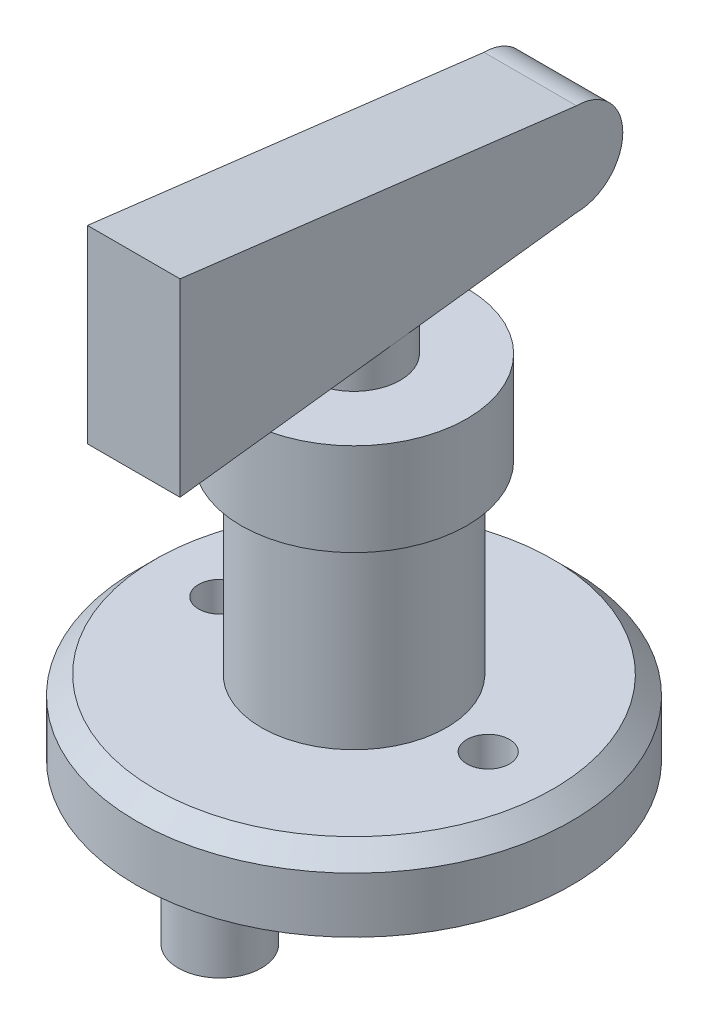
ISO-10303-21;
HEADER;
FILE_DESCRIPTION(('STEP AP214'),'2;1');
FILE_NAME('part.step','',(''),(''),'','','');
FILE_SCHEMA(('AUTOMOTIVE_DESIGN { 1 0 10303 214 1 1 1 1 }'));
ENDSEC;
DATA;
#1=APPLICATION_CONTEXT('core data for automotive mechanical design processes');
#2=APPLICATION_PROTOCOL_DEFINITION('international standard','automotive_design',2000,#1);
#3=PRODUCT_CONTEXT('',#1,'mechanical');
#4=PRODUCT('Part','Part','',(#3));
#5=PRODUCT_RELATED_PRODUCT_CATEGORY('part','',(#4));
#6=PRODUCT_DEFINITION_FORMATION('','',#4);
#7=PRODUCT_DEFINITION_CONTEXT('part definition',#1,'design');
#8=PRODUCT_DEFINITION('design','',#6,#7);
#9=PRODUCT_DEFINITION_SHAPE('','',#8);
#10=(LENGTH_UNIT() NAMED_UNIT(*) SI_UNIT(.MILLI.,.METRE.));
#11=(NAMED_UNIT(*) PLANE_ANGLE_UNIT() SI_UNIT($,.RADIAN.));
#12=(NAMED_UNIT(*) SI_UNIT($,.STERADIAN.) SOLID_ANGLE_UNIT());
#13=UNCERTAINTY_MEASURE_WITH_UNIT(LENGTH_MEASURE(1.E-05),#10,'distance_accuracy_value','');
#14=(GEOMETRIC_REPRESENTATION_CONTEXT(3) GLOBAL_UNCERTAINTY_ASSIGNED_CONTEXT((#13)) GLOBAL_UNIT_ASSIGNED_CONTEXT((#10,
#11,#12)) REPRESENTATION_CONTEXT('',''));
#15=CARTESIAN_POINT('',(0.,0.,0.));
#16=DIRECTION('',(0.,0.,1.));
#17=DIRECTION('',(1.,0.,0.));
#18=AXIS2_PLACEMENT_3D('',#15,#16,#17);
#19=CARTESIAN_POINT('',(6.35,49.4697102038094,30.2258026670804));
#20=DIRECTION('',(0.,0.992652007135844,0.121004102117163));
#21=DIRECTION('',(0.,-0.121004102117163,0.992652007135844));
#22=AXIS2_PLACEMENT_3D('',#19,#20,#21);
#23=PLANE('',#22);
#24=DIRECTION('',(0.,0.121004102117163,-0.992652007135844));
#25=VECTOR('',#24,1.);
#26=CARTESIAN_POINT('',(6.35,49.4697102038094,30.2258026670804));
#27=LINE('',#26,#25);
#28=CARTESIAN_POINT('',(6.35,53.1542301425276,0.));
#29=VERTEX_POINT('',#28);
#30=CARTESIAN_POINT('',(6.35,56.1025343808888,-24.1862884699785));
#31=VERTEX_POINT('',#30);
#32=EDGE_CURVE('E74',#29,#31,#27,.T.);
#33=ORIENTED_EDGE('',*,*,#32,.F.);
#34=CARTESIAN_POINT('',(0.,53.1542301425276,0.));
#35=DIRECTION('',(0.,0.992652007135844,0.121004102117163));
#36=DIRECTION('',(0.,-0.121004102117163,0.992652007135844));
#37=AXIS2_PLACEMENT_3D('',#34,#35,#36);
#38=ELLIPSE('',#37,6.3970051481808,6.35);
#39=CARTESIAN_POINT('',(-6.35,53.1542301425276,0.));
#40=VERTEX_POINT('',#39);
#41=EDGE_CURVE('E65',#29,#40,#38,.T.);
#42=ORIENTED_EDGE('',*,*,#41,.T.);
#43=DIRECTION('',(0.,0.121004102117163,-0.992652007135844));
#44=VECTOR('',#43,1.);
#45=CARTESIAN_POINT('',(-6.35,49.4697102038094,30.2258026670804));
#46=LINE('',#45,#44);
#47=CARTESIAN_POINT('',(-6.35,56.1025343808888,-24.1862884699785));
#48=VERTEX_POINT('',#47);
#49=EDGE_CURVE('E95',#40,#48,#46,.T.);
#50=ORIENTED_EDGE('',*,*,#49,.T.);
#51=DIRECTION('',(-1.,0.,0.));
#52=VECTOR('',#51,1.);
#53=CARTESIAN_POINT('',(6.35,56.1025343808888,-24.1862884699785));
#54=LINE('',#53,#52);
#55=EDGE_CURVE('E130',#31,#48,#54,.T.);
#56=ORIENTED_EDGE('',*,*,#55,.F.);
#57=EDGE_LOOP('',(#33,#42,#50,#56));
#58=FACE_BOUND('',#57,.T.);
#59=ADVANCED_FACE('F51',(#58),#23,.F.);
#60=CARTESIAN_POINT('',(6.35,62.4525343808888,-24.1862884699785));
#61=DIRECTION('',(-1.,0.,0.));
#62=DIRECTION('',(0.,0.,1.));
#63=AXIS2_PLACEMENT_3D('',#60,#61,#62);
#64=CYLINDRICAL_SURFACE('',#63,6.35);
#65=CARTESIAN_POINT('',(-6.35,62.4525343808888,-24.1862884699785));
#66=DIRECTION('',(1.,0.,0.));
#67=DIRECTION('',(0.,0.,-1.));
#68=AXIS2_PLACEMENT_3D('',#65,#66,#67);
#69=CIRCLE('',#68,6.35);
#70=CARTESIAN_POINT('',(-6.35,68.8025343808888,-24.1862884699785));
#71=VERTEX_POINT('',#70);
#72=EDGE_CURVE('E111',#48,#71,#69,.T.);
#73=ORIENTED_EDGE('',*,*,#72,.T.);
#74=DIRECTION('',(-1.,0.,0.));
#75=VECTOR('',#74,1.);
#76=CARTESIAN_POINT('',(6.35,68.8025343808888,-24.1862884699785));
#77=LINE('',#76,#75);
#78=CARTESIAN_POINT('',(6.35,68.8025343808888,-24.1862884699785));
#79=VERTEX_POINT('',#78);
#80=EDGE_CURVE('E12',#79,#71,#77,.T.);
#81=ORIENTED_EDGE('',*,*,#80,.F.);
#82=CARTESIAN_POINT('',(6.35,62.4525343808888,-24.1862884699785));
#83=DIRECTION('',(1.,0.,0.));
#84=DIRECTION('',(0.,0.,-1.));
#85=AXIS2_PLACEMENT_3D('',#82,#83,#84);
#86=CIRCLE('',#85,6.35);
#87=EDGE_CURVE('E125',#31,#79,#86,.T.);
#88=ORIENTED_EDGE('',*,*,#87,.F.);
#89=ORIENTED_EDGE('',*,*,#55,.T.);
#90=EDGE_LOOP('',(#73,#81,#88,#89));
#91=FACE_BOUND('',#90,.T.);
#92=ADVANCED_FACE('F53',(#91),#64,.T.);
#93=CARTESIAN_POINT('',(6.35,68.8025343808888,-24.1862884699785));
#94=DIRECTION('',(0.,-0.992652007135844,0.121004102117162));
#95=DIRECTION('',(0.,-0.121004102117162,-0.992652007135844));
#96=AXIS2_PLACEMENT_3D('',#93,#94,#95);
#97=PLANE('',#96);
#98=DIRECTION('',(0.,0.121004102117162,0.992652007135844));
#99=VECTOR('',#98,1.);
#100=CARTESIAN_POINT('',(-6.35,68.8025343808888,-24.1862884699785));
#101=LINE('',#100,#99);
#102=CARTESIAN_POINT('',(-6.35,75.4353585579682,30.2258026670804));
#103=VERTEX_POINT('',#102);
#104=EDGE_CURVE('E138',#71,#103,#101,.T.);
#105=ORIENTED_EDGE('',*,*,#104,.T.);
#106=DIRECTION('',(-1.,0.,0.));
#107=VECTOR('',#106,1.);
#108=CARTESIAN_POINT('',(6.35,75.4353585579682,30.2258026670804));
#109=LINE('',#108,#107);
#110=CARTESIAN_POINT('',(6.35,75.4353585579682,30.2258026670804));
#111=VERTEX_POINT('',#110);
#112=EDGE_CURVE('E59',#111,#103,#109,.T.);
#113=ORIENTED_EDGE('',*,*,#112,.F.);
#114=DIRECTION('',(0.,0.121004102117162,0.992652007135844));
#115=VECTOR('',#114,1.);
#116=CARTESIAN_POINT('',(6.35,68.8025343808888,-24.1862884699785));
#117=LINE('',#116,#115);
#118=EDGE_CURVE('E102',#79,#111,#117,.T.);
#119=ORIENTED_EDGE('',*,*,#118,.F.);
#120=ORIENTED_EDGE('',*,*,#80,.T.);
#121=EDGE_LOOP('',(#105,#113,#119,#120));
#122=FACE_BOUND('',#121,.T.);
#123=ADVANCED_FACE('F160',(#122),#97,.F.);
#124=CARTESIAN_POINT('',(6.35,75.4353585579682,30.2258026670804));
#125=DIRECTION('',(0.,0.,-1.));
#126=DIRECTION('',(-1.,0.,0.));
#127=AXIS2_PLACEMENT_3D('',#124,#125,#126);
#128=PLANE('',#127);
#129=DIRECTION('',(0.,-1.,0.));
#130=VECTOR('',#129,1.);
#131=CARTESIAN_POINT('',(-6.35,75.4353585579682,30.2258026670804));
#132=LINE('',#131,#130);
#133=CARTESIAN_POINT('',(-6.35,49.4697102038094,30.2258026670804));
#134=VERTEX_POINT('',#133);
#135=EDGE_CURVE('E119',#103,#134,#132,.T.);
#136=ORIENTED_EDGE('',*,*,#135,.T.);
#137=DIRECTION('',(-1.,0.,0.));
#138=VECTOR('',#137,1.);
#139=CARTESIAN_POINT('',(6.35,49.4697102038094,30.2258026670804));
#140=LINE('',#139,#138);
#141=CARTESIAN_POINT('',(6.35,49.4697102038094,30.2258026670804));
#142=VERTEX_POINT('',#141);
#143=EDGE_CURVE('E124',#142,#134,#140,.T.);
#144=ORIENTED_EDGE('',*,*,#143,.F.);
#145=DIRECTION('',(0.,-1.,0.));
#146=VECTOR('',#145,1.);
#147=CARTESIAN_POINT('',(6.35,75.4353585579682,30.2258026670804));
#148=LINE('',#147,#146);
#149=EDGE_CURVE('E137',#111,#142,#148,.T.);
#150=ORIENTED_EDGE('',*,*,#149,.F.);
#151=ORIENTED_EDGE('',*,*,#112,.T.);
#152=EDGE_LOOP('',(#136,#144,#150,#151));
#153=FACE_BOUND('',#152,.T.);
#154=ADVANCED_FACE('F136',(#153),#128,.F.);
#155=EDGE_CURVE('E117',#134,#40,#46,.T.);
#156=ORIENTED_EDGE('',*,*,#155,.T.);
#157=EDGE_CURVE('E104',#40,#29,#38,.T.);
#158=ORIENTED_EDGE('',*,*,#157,.T.);
#159=EDGE_CURVE('E132',#142,#29,#27,.T.);
#160=ORIENTED_EDGE('',*,*,#159,.F.);
#161=ORIENTED_EDGE('',*,*,#143,.T.);
#162=EDGE_LOOP('',(#156,#158,#160,#161));
#163=FACE_BOUND('',#162,.T.);
#164=ADVANCED_FACE('F122',(#163),#23,.F.);
#165=CARTESIAN_POINT('',(6.35,62.4525343808888,-24.1862884699785));
#166=DIRECTION('',(1.,0.,0.));
#167=DIRECTION('',(0.,0.,-1.));
#168=AXIS2_PLACEMENT_3D('',#165,#166,#167);
#169=PLANE('',#168);
#170=ORIENTED_EDGE('',*,*,#87,.T.);
#171=ORIENTED_EDGE('',*,*,#118,.T.);
#172=ORIENTED_EDGE('',*,*,#149,.T.);
#173=ORIENTED_EDGE('',*,*,#159,.T.);
#174=ORIENTED_EDGE('',*,*,#32,.T.);
#175=EDGE_LOOP('',(#170,#171,#172,#173,#174));
#176=FACE_BOUND('',#175,.T.);
#177=ADVANCED_FACE('F165',(#176),#169,.T.);
#178=CARTESIAN_POINT('',(-6.35,62.4525343808888,-24.1862884699785));
#179=DIRECTION('',(1.,0.,0.));
#180=DIRECTION('',(0.,0.,-1.));
#181=AXIS2_PLACEMENT_3D('',#178,#179,#180);
#182=PLANE('',#181);
#183=ORIENTED_EDGE('',*,*,#72,.F.);
#184=ORIENTED_EDGE('',*,*,#49,.F.);
#185=ORIENTED_EDGE('',*,*,#155,.F.);
#186=ORIENTED_EDGE('',*,*,#135,.F.);
#187=ORIENTED_EDGE('',*,*,#104,.F.);
#188=EDGE_LOOP('',(#183,#184,#185,#186,#187));
#189=FACE_BOUND('',#188,.T.);
#190=ADVANCED_FACE('F115',(#189),#182,.F.);
#191=CARTESIAN_POINT('',(0.,71.1812177027245,0.));
#192=DIRECTION('',(0.,-1.,0.));
#193=DIRECTION('',(0.,0.,-1.));
#194=AXIS2_PLACEMENT_3D('',#191,#192,#193);
#195=CYLINDRICAL_SURFACE('',#194,6.35);
#196=CARTESIAN_POINT('',(0.,48.26,0.));
#197=DIRECTION('',(0.,1.,0.));
#198=DIRECTION('',(0.,0.,1.));
#199=AXIS2_PLACEMENT_3D('',#196,#197,#198);
#200=CIRCLE('',#199,6.35);
#201=CARTESIAN_POINT('',(0.,48.26,6.35));
#202=VERTEX_POINT('',#201);
#203=EDGE_CURVE('E109',#202,#202,#200,.T.);
#204=ORIENTED_EDGE('',*,*,#203,.T.);
#205=EDGE_LOOP('',(#204));
#206=FACE_BOUND('',#205,.T.);
#207=ORIENTED_EDGE('',*,*,#41,.F.);
#208=ORIENTED_EDGE('',*,*,#157,.F.);
#209=EDGE_LOOP('',(#207,#208));
#210=FACE_BOUND('',#209,.T.);
#211=ADVANCED_FACE('F105',(#206,#210),#195,.T.);
#212=CARTESIAN_POINT('',(0.,48.26,0.));
#213=DIRECTION('',(0.,1.,0.));
#214=DIRECTION('',(0.,0.,1.));
#215=AXIS2_PLACEMENT_3D('',#212,#213,#214);
#216=PLANE('',#215);
#217=ORIENTED_EDGE('',*,*,#203,.F.);
#218=EDGE_LOOP('',(#217));
#219=FACE_BOUND('',#218,.T.);
#220=ADVANCED_FACE('F148',(#219),#216,.F.);
#221=CLOSED_SHELL('',(#59,#92,#123,#154,#164,#177,#190,#211,#220));
#222=MANIFOLD_SOLID_BREP('B2',#221);
#223=CARTESIAN_POINT('',(0.,10.16,0.));
#224=DIRECTION('',(0.,1.,0.));
#225=DIRECTION('',(0.,0.,1.));
#226=AXIS2_PLACEMENT_3D('',#223,#224,#225);
#227=PLANE('',#226);
#228=CARTESIAN_POINT('',(0.,10.16,0.));
#229=DIRECTION('',(0.,1.,0.));
#230=DIRECTION('',(0.,0.,1.));
#231=AXIS2_PLACEMENT_3D('',#228,#229,#230);
#232=CIRCLE('',#231,27.305);
#233=CARTESIAN_POINT('',(0.,10.16,27.305));
#234=VERTEX_POINT('',#233);
#235=EDGE_CURVE('E239',#234,#234,#232,.T.);
#236=ORIENTED_EDGE('',*,*,#235,.T.);
#237=EDGE_LOOP('',(#236));
#238=FACE_BOUND('',#237,.T.);
#239=CARTESIAN_POINT('',(0.,10.16,0.));
#240=DIRECTION('',(0.,1.,0.));
#241=DIRECTION('',(0.,0.,1.));
#242=AXIS2_PLACEMENT_3D('',#239,#240,#241);
#243=CIRCLE('',#242,12.7);
#244=CARTESIAN_POINT('',(0.,10.16,12.7));
#245=VERTEX_POINT('',#244);
#246=EDGE_CURVE('E243',#245,#245,#243,.T.);
#247=ORIENTED_EDGE('',*,*,#246,.F.);
#248=EDGE_LOOP('',(#247));
#249=FACE_BOUND('',#248,.T.);
#250=CARTESIAN_POINT('',(-18.415,10.16,0.));
#251=DIRECTION('',(0.,1.,0.));
#252=DIRECTION('',(0.,0.,1.));
#253=AXIS2_PLACEMENT_3D('',#250,#251,#252);
#254=CIRCLE('',#253,2.921);
#255=CARTESIAN_POINT('',(-18.415,10.16,2.92100000000001));
#256=VERTEX_POINT('',#255);
#257=EDGE_CURVE('E267',#256,#256,#254,.T.);
#258=ORIENTED_EDGE('',*,*,#257,.F.);
#259=EDGE_LOOP('',(#258));
#260=FACE_BOUND('',#259,.T.);
#261=CARTESIAN_POINT('',(18.415,10.16,0.));
#262=DIRECTION('',(0.,1.,0.));
#263=DIRECTION('',(0.,0.,1.));
#264=AXIS2_PLACEMENT_3D('',#261,#262,#263);
#265=CIRCLE('',#264,2.921);
#266=CARTESIAN_POINT('',(18.415,10.16,2.921));
#267=VERTEX_POINT('',#266);
#268=EDGE_CURVE('E264',#267,#267,#265,.F.);
#269=ORIENTED_EDGE('',*,*,#268,.T.);
#270=EDGE_LOOP('',(#269));
#271=FACE_BOUND('',#270,.T.);
#272=ADVANCED_FACE('F232',(#238,#249,#260,#271),#227,.T.);
#273=CARTESIAN_POINT('',(0.,0.,0.));
#274=DIRECTION('',(0.,1.,0.));
#275=DIRECTION('',(0.,0.,1.));
#276=AXIS2_PLACEMENT_3D('',#273,#274,#275);
#277=PLANE('',#276);
#278=CARTESIAN_POINT('',(-18.415,0.,0.));
#279=DIRECTION('',(0.,-1.,0.));
#280=DIRECTION('',(0.,0.,-1.));
#281=AXIS2_PLACEMENT_3D('',#278,#279,#280);
#282=CIRCLE('',#281,2.921);
#283=CARTESIAN_POINT('',(-18.415,0.,-2.921));
#284=VERTEX_POINT('',#283);
#285=EDGE_CURVE('E271',#284,#284,#282,.T.);
#286=ORIENTED_EDGE('',*,*,#285,.F.);
#287=EDGE_LOOP('',(#286));
#288=FACE_BOUND('',#287,.T.);
#289=CARTESIAN_POINT('',(0.,0.,18.415));
#290=DIRECTION('',(0.,1.,0.));
#291=DIRECTION('',(0.,0.,1.));
#292=AXIS2_PLACEMENT_3D('',#289,#290,#291);
#293=CIRCLE('',#292,5.715);
#294=CARTESIAN_POINT('',(0.,0.,24.13));
#295=VERTEX_POINT('',#294);
#296=EDGE_CURVE('E247',#295,#295,#293,.F.);
#297=ORIENTED_EDGE('',*,*,#296,.F.);
#298=EDGE_LOOP('',(#297));
#299=FACE_BOUND('',#298,.T.);
#300=CARTESIAN_POINT('',(0.,0.,-18.415));
#301=DIRECTION('',(0.,1.,0.));
#302=DIRECTION('',(0.,0.,1.));
#303=AXIS2_PLACEMENT_3D('',#300,#301,#302);
#304=CIRCLE('',#303,5.715);
#305=CARTESIAN_POINT('',(0.,0.,-12.7));
#306=VERTEX_POINT('',#305);
#307=EDGE_CURVE('E256',#306,#306,#304,.T.);
#308=ORIENTED_EDGE('',*,*,#307,.T.);
#309=EDGE_LOOP('',(#308));
#310=FACE_BOUND('',#309,.T.);
#311=CARTESIAN_POINT('',(0.,0.,0.));
#312=DIRECTION('',(0.,1.,0.));
#313=DIRECTION('',(0.,0.,1.));
#314=AXIS2_PLACEMENT_3D('',#311,#312,#313);
#315=CIRCLE('',#314,29.845);
#316=CARTESIAN_POINT('',(0.,0.,29.845));
#317=VERTEX_POINT('',#316);
#318=EDGE_CURVE('E252',#317,#317,#315,.T.);
#319=ORIENTED_EDGE('',*,*,#318,.F.);
#320=EDGE_LOOP('',(#319));
#321=FACE_BOUND('',#320,.T.);
#322=CARTESIAN_POINT('',(18.415,0.,0.));
#323=DIRECTION('',(0.,1.,0.));
#324=DIRECTION('',(0.,0.,1.));
#325=AXIS2_PLACEMENT_3D('',#322,#323,#324);
#326=CIRCLE('',#325,2.921);
#327=CARTESIAN_POINT('',(18.415,0.,2.921));
#328=VERTEX_POINT('',#327);
#329=EDGE_CURVE('E270',#328,#328,#326,.T.);
#330=ORIENTED_EDGE('',*,*,#329,.T.);
#331=EDGE_LOOP('',(#330));
#332=FACE_BOUND('',#331,.T.);
#333=ADVANCED_FACE('F303',(#288,#299,#310,#321,#332),#277,.F.);
#334=CARTESIAN_POINT('',(0.,10.16,0.));
#335=DIRECTION('',(0.,-1.,0.));
#336=DIRECTION('',(0.,0.,-1.));
#337=AXIS2_PLACEMENT_3D('',#334,#335,#336);
#338=CYLINDRICAL_SURFACE('',#337,29.845);
#339=CARTESIAN_POINT('',(0.,7.61999999999999,0.));
#340=DIRECTION('',(0.,1.,0.));
#341=DIRECTION('',(0.,0.,1.));
#342=AXIS2_PLACEMENT_3D('',#339,#340,#341);
#343=CIRCLE('',#342,29.845);
#344=CARTESIAN_POINT('',(0.,7.61999999999999,29.845));
#345=VERTEX_POINT('',#344);
#346=EDGE_CURVE('E50',#345,#345,#343,.F.);
#347=ORIENTED_EDGE('',*,*,#346,.T.);
#348=EDGE_LOOP('',(#347));
#349=FACE_BOUND('',#348,.T.);
#350=ORIENTED_EDGE('',*,*,#318,.T.);
#351=EDGE_LOOP('',(#350));
#352=FACE_BOUND('',#351,.T.);
#353=ADVANCED_FACE('F308',(#349,#352),#338,.T.);
#354=CARTESIAN_POINT('',(0.,-12.7,-18.415));
#355=DIRECTION('',(0.,1.,0.));
#356=DIRECTION('',(0.,0.,1.));
#357=AXIS2_PLACEMENT_3D('',#354,#355,#356);
#358=CYLINDRICAL_SURFACE('',#357,5.715);
#359=CARTESIAN_POINT('',(0.,-12.7,-18.415));
#360=DIRECTION('',(0.,1.,0.));
#361=DIRECTION('',(0.,0.,1.));
#362=AXIS2_PLACEMENT_3D('',#359,#360,#361);
#363=CIRCLE('',#362,5.715);
#364=CARTESIAN_POINT('',(0.,-12.7,-12.7));
#365=VERTEX_POINT('',#364);
#366=EDGE_CURVE('E255',#365,#365,#363,.T.);
#367=ORIENTED_EDGE('',*,*,#366,.T.);
#368=EDGE_LOOP('',(#367));
#369=FACE_BOUND('',#368,.T.);
#370=ORIENTED_EDGE('',*,*,#307,.F.);
#371=EDGE_LOOP('',(#370));
#372=FACE_BOUND('',#371,.T.);
#373=ADVANCED_FACE('F313',(#369,#372),#358,.T.);
#374=CARTESIAN_POINT('',(0.,-12.7,-18.415));
#375=DIRECTION('',(0.,1.,0.));
#376=DIRECTION('',(0.,0.,1.));
#377=AXIS2_PLACEMENT_3D('',#374,#375,#376);
#378=PLANE('',#377);
#379=ORIENTED_EDGE('',*,*,#366,.F.);
#380=EDGE_LOOP('',(#379));
#381=FACE_BOUND('',#380,.T.);
#382=ADVANCED_FACE('F319',(#381),#378,.F.);
#383=CARTESIAN_POINT('',(0.,-12.7,18.415));
#384=DIRECTION('',(0.,1.,0.));
#385=DIRECTION('',(0.,0.,1.));
#386=AXIS2_PLACEMENT_3D('',#383,#384,#385);
#387=CYLINDRICAL_SURFACE('',#386,5.715);
#388=CARTESIAN_POINT('',(0.,-12.7,18.415));
#389=DIRECTION('',(0.,-1.,0.));
#390=DIRECTION('',(0.,0.,-1.));
#391=AXIS2_PLACEMENT_3D('',#388,#389,#390);
#392=CIRCLE('',#391,5.715);
#393=CARTESIAN_POINT('',(0.,-12.7,12.7));
#394=VERTEX_POINT('',#393);
#395=EDGE_CURVE('E259',#394,#394,#392,.T.);
#396=ORIENTED_EDGE('',*,*,#395,.F.);
#397=EDGE_LOOP('',(#396));
#398=FACE_BOUND('',#397,.T.);
#399=ORIENTED_EDGE('',*,*,#296,.T.);
#400=EDGE_LOOP('',(#399));
#401=FACE_BOUND('',#400,.T.);
#402=ADVANCED_FACE('F344',(#398,#401),#387,.T.);
#403=CARTESIAN_POINT('',(0.,-12.7,18.415));
#404=DIRECTION('',(0.,-1.,0.));
#405=DIRECTION('',(0.,0.,-1.));
#406=AXIS2_PLACEMENT_3D('',#403,#404,#405);
#407=PLANE('',#406);
#408=ORIENTED_EDGE('',*,*,#395,.T.);
#409=EDGE_LOOP('',(#408));
#410=FACE_BOUND('',#409,.T.);
#411=ADVANCED_FACE('F339',(#410),#407,.T.);
#412=CARTESIAN_POINT('',(-18.415,12.7,0.));
#413=DIRECTION('',(0.,-1.,0.));
#414=DIRECTION('',(0.,0.,-1.));
#415=AXIS2_PLACEMENT_3D('',#412,#413,#414);
#416=CYLINDRICAL_SURFACE('',#415,2.921);
#417=ORIENTED_EDGE('',*,*,#257,.T.);
#418=EDGE_LOOP('',(#417));
#419=FACE_BOUND('',#418,.T.);
#420=ORIENTED_EDGE('',*,*,#285,.T.);
#421=EDGE_LOOP('',(#420));
#422=FACE_BOUND('',#421,.T.);
#423=ADVANCED_FACE('F330',(#419,#422),#416,.F.);
#424=CARTESIAN_POINT('',(18.415,12.7,0.));
#425=DIRECTION('',(0.,-1.,0.));
#426=DIRECTION('',(0.,0.,-1.));
#427=AXIS2_PLACEMENT_3D('',#424,#425,#426);
#428=CYLINDRICAL_SURFACE('',#427,2.921);
#429=ORIENTED_EDGE('',*,*,#268,.F.);
#430=EDGE_LOOP('',(#429));
#431=FACE_BOUND('',#430,.T.);
#432=ORIENTED_EDGE('',*,*,#329,.F.);
#433=EDGE_LOOP('',(#432));
#434=FACE_BOUND('',#433,.T.);
#435=ADVANCED_FACE('F327',(#431,#434),#428,.F.);
#436=CARTESIAN_POINT('',(0.,35.56,0.));
#437=DIRECTION('',(0.,-1.,0.));
#438=DIRECTION('',(0.,0.,-1.));
#439=AXIS2_PLACEMENT_3D('',#436,#437,#438);
#440=CYLINDRICAL_SURFACE('',#439,12.7);
#441=CARTESIAN_POINT('',(0.,35.56,0.));
#442=DIRECTION('',(0.,1.,0.));
#443=DIRECTION('',(0.,0.,1.));
#444=AXIS2_PLACEMENT_3D('',#441,#442,#443);
#445=CIRCLE('',#444,12.7);
#446=CARTESIAN_POINT('',(0.,35.56,12.7));
#447=VERTEX_POINT('',#446);
#448=EDGE_CURVE('E274',#447,#447,#445,.T.);
#449=ORIENTED_EDGE('',*,*,#448,.F.);
#450=EDGE_LOOP('',(#449));
#451=FACE_BOUND('',#450,.T.);
#452=ORIENTED_EDGE('',*,*,#246,.T.);
#453=EDGE_LOOP('',(#452));
#454=FACE_BOUND('',#453,.T.);
#455=ADVANCED_FACE('F329',(#451,#454),#440,.T.);
#456=CARTESIAN_POINT('',(0.,10.16,0.));
#457=DIRECTION('',(0.,-1.,0.));
#458=DIRECTION('',(0.,0.,-1.));
#459=AXIS2_PLACEMENT_3D('',#456,#457,#458);
#460=CONICAL_SURFACE('',#459,27.305,0.785398163397448);
#461=ORIENTED_EDGE('',*,*,#346,.F.);
#462=EDGE_LOOP('',(#461));
#463=FACE_BOUND('',#462,.T.);
#464=ORIENTED_EDGE('',*,*,#235,.F.);
#465=EDGE_LOOP('',(#464));
#466=FACE_BOUND('',#465,.T.);
#467=ADVANCED_FACE('F234',(#463,#466),#460,.T.);
#468=CARTESIAN_POINT('',(0.,48.26,0.));
#469=DIRECTION('',(0.,-1.,0.));
#470=DIRECTION('',(0.,0.,-1.));
#471=AXIS2_PLACEMENT_3D('',#468,#469,#470);
#472=CYLINDRICAL_SURFACE('',#471,15.494);
#473=CARTESIAN_POINT('',(0.,48.26,0.));
#474=DIRECTION('',(0.,1.,0.));
#475=DIRECTION('',(0.,0.,1.));
#476=AXIS2_PLACEMENT_3D('',#473,#474,#475);
#477=CIRCLE('',#476,15.494);
#478=CARTESIAN_POINT('',(0.,48.26,15.494));
#479=VERTEX_POINT('',#478);
#480=EDGE_CURVE('E279',#479,#479,#477,.T.);
#481=ORIENTED_EDGE('',*,*,#480,.F.);
#482=EDGE_LOOP('',(#481));
#483=FACE_BOUND('',#482,.T.);
#484=CARTESIAN_POINT('',(0.,35.56,0.));
#485=DIRECTION('',(0.,1.,0.));
#486=DIRECTION('',(0.,0.,1.));
#487=AXIS2_PLACEMENT_3D('',#484,#485,#486);
#488=CIRCLE('',#487,15.494);
#489=CARTESIAN_POINT('',(0.,35.56,15.494));
#490=VERTEX_POINT('',#489);
#491=EDGE_CURVE('E280',#490,#490,#488,.T.);
#492=ORIENTED_EDGE('',*,*,#491,.T.);
#493=EDGE_LOOP('',(#492));
#494=FACE_BOUND('',#493,.T.);
#495=ADVANCED_FACE('F288',(#483,#494),#472,.T.);
#496=CARTESIAN_POINT('',(0.,48.26,0.));
#497=DIRECTION('',(0.,1.,0.));
#498=DIRECTION('',(0.,0.,1.));
#499=AXIS2_PLACEMENT_3D('',#496,#497,#498);
#500=PLANE('',#499);
#501=ORIENTED_EDGE('',*,*,#480,.T.);
#502=EDGE_LOOP('',(#501));
#503=FACE_BOUND('',#502,.T.);
#504=ADVANCED_FACE('F286',(#503),#500,.T.);
#505=CARTESIAN_POINT('',(0.,35.56,0.));
#506=DIRECTION('',(0.,1.,0.));
#507=DIRECTION('',(0.,0.,1.));
#508=AXIS2_PLACEMENT_3D('',#505,#506,#507);
#509=PLANE('',#508);
#510=ORIENTED_EDGE('',*,*,#448,.T.);
#511=EDGE_LOOP('',(#510));
#512=FACE_BOUND('',#511,.T.);
#513=ORIENTED_EDGE('',*,*,#491,.F.);
#514=EDGE_LOOP('',(#513));
#515=FACE_BOUND('',#514,.T.);
#516=ADVANCED_FACE('F294',(#512,#515),#509,.F.);
#517=CLOSED_SHELL('',(#272,#333,#353,#373,#382,#402,#411,#423,#435,#455,#467,#495,#504,#516));
#518=MANIFOLD_SOLID_BREP('B6',#517);
#519=ADVANCED_BREP_SHAPE_REPRESENTATION('',(#18,#222,#518),#14);
#520=SHAPE_DEFINITION_REPRESENTATION(#9,#519);
ENDSEC;
END-ISO-10303-21;
